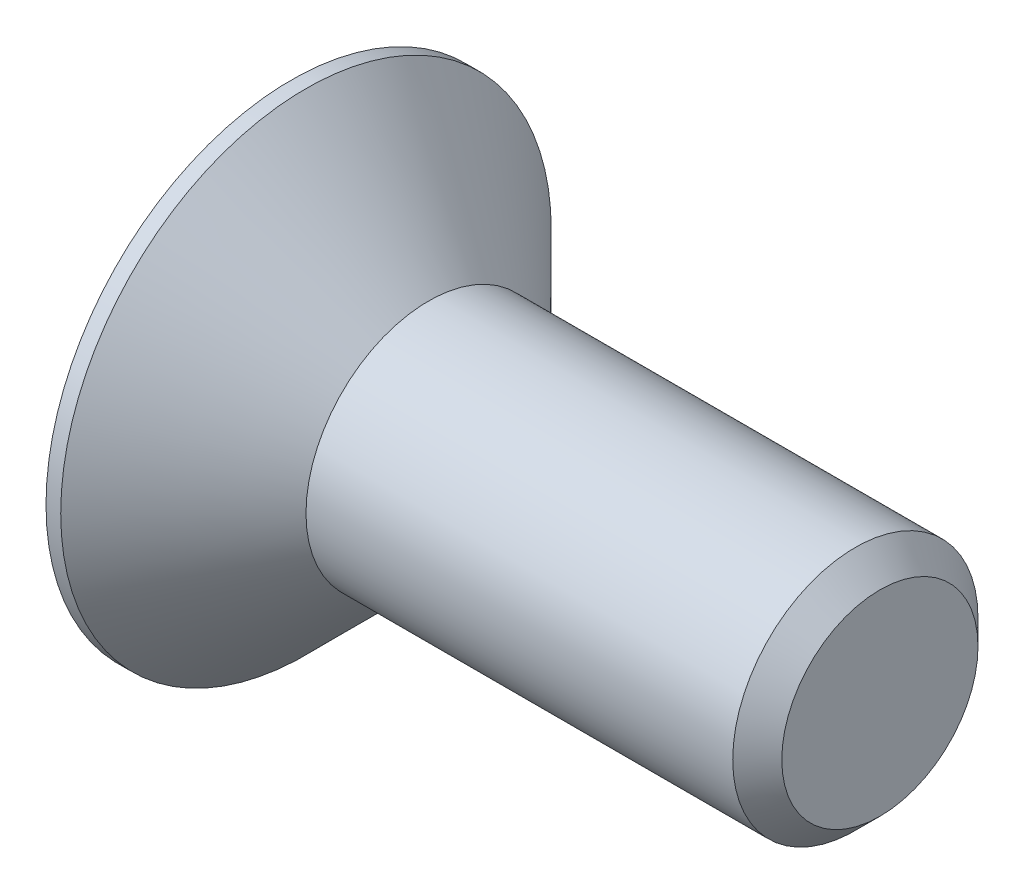
ISO-10303-21;
HEADER;
FILE_DESCRIPTION(('STEP AP214'),'2;1');
FILE_NAME('part.step','',(''),(''),'','','');
FILE_SCHEMA(('AUTOMOTIVE_DESIGN { 1 0 10303 214 1 1 1 1 }'));
ENDSEC;
DATA;
#1=APPLICATION_CONTEXT('core data for automotive mechanical design processes');
#2=APPLICATION_PROTOCOL_DEFINITION('international standard','automotive_design',2000,#1);
#3=PRODUCT_CONTEXT('',#1,'mechanical');
#4=PRODUCT('Part','Part','',(#3));
#5=PRODUCT_RELATED_PRODUCT_CATEGORY('part','',(#4));
#6=PRODUCT_DEFINITION_FORMATION('','',#4);
#7=PRODUCT_DEFINITION_CONTEXT('part definition',#1,'design');
#8=PRODUCT_DEFINITION('design','',#6,#7);
#9=PRODUCT_DEFINITION_SHAPE('','',#8);
#10=(LENGTH_UNIT() NAMED_UNIT(*) SI_UNIT(.MILLI.,.METRE.));
#11=(NAMED_UNIT(*) PLANE_ANGLE_UNIT() SI_UNIT($,.RADIAN.));
#12=(NAMED_UNIT(*) SI_UNIT($,.STERADIAN.) SOLID_ANGLE_UNIT());
#13=UNCERTAINTY_MEASURE_WITH_UNIT(LENGTH_MEASURE(1.E-05),#10,'distance_accuracy_value','');
#14=(GEOMETRIC_REPRESENTATION_CONTEXT(3) GLOBAL_UNCERTAINTY_ASSIGNED_CONTEXT((#13)) GLOBAL_UNIT_ASSIGNED_CONTEXT((#10,
#11,#12)) REPRESENTATION_CONTEXT('',''));
#15=CARTESIAN_POINT('',(0.,0.,0.));
#16=DIRECTION('',(0.,0.,1.));
#17=DIRECTION('',(1.,0.,0.));
#18=AXIS2_PLACEMENT_3D('',#15,#16,#17);
#19=CARTESIAN_POINT('',(0.,0.,0.));
#20=DIRECTION('',(1.,0.,0.));
#21=DIRECTION('',(0.,0.,-1.));
#22=AXIS2_PLACEMENT_3D('',#19,#20,#21);
#23=PLANE('',#22);
#24=DIRECTION('',(0.,0.866025403784439,0.5));
#25=VECTOR('',#24,1.);
#26=CARTESIAN_POINT('',(0.,-0.75,0.433012701892219));
#27=LINE('',#26,#25);
#28=CARTESIAN_POINT('',(0.,-0.75,0.433012701892219));
#29=VERTEX_POINT('',#28);
#30=CARTESIAN_POINT('',(0.,0.,0.866025403784438));
#31=VERTEX_POINT('',#30);
#32=EDGE_CURVE('E131',#29,#31,#27,.T.);
#33=ORIENTED_EDGE('',*,*,#32,.F.);
#34=DIRECTION('',(0.,0.,1.));
#35=VECTOR('',#34,1.);
#36=CARTESIAN_POINT('',(0.,-0.75,-0.43301270189222));
#37=LINE('',#36,#35);
#38=CARTESIAN_POINT('',(0.,-0.75,-0.43301270189222));
#39=VERTEX_POINT('',#38);
#40=EDGE_CURVE('E53',#39,#29,#37,.T.);
#41=ORIENTED_EDGE('',*,*,#40,.F.);
#42=DIRECTION('',(0.,-0.866025403784439,0.5));
#43=VECTOR('',#42,1.);
#44=CARTESIAN_POINT('',(0.,0.,-0.866025403784439));
#45=LINE('',#44,#43);
#46=CARTESIAN_POINT('',(0.,0.,-0.866025403784439));
#47=VERTEX_POINT('',#46);
#48=EDGE_CURVE('E140',#47,#39,#45,.T.);
#49=ORIENTED_EDGE('',*,*,#48,.F.);
#50=DIRECTION('',(0.,-0.866025403784439,-0.5));
#51=VECTOR('',#50,1.);
#52=CARTESIAN_POINT('',(0.,0.75,-0.43301270189222));
#53=LINE('',#52,#51);
#54=CARTESIAN_POINT('',(0.,0.75,-0.43301270189222));
#55=VERTEX_POINT('',#54);
#56=EDGE_CURVE('E138',#55,#47,#53,.T.);
#57=ORIENTED_EDGE('',*,*,#56,.F.);
#58=DIRECTION('',(0.,0.,-1.));
#59=VECTOR('',#58,1.);
#60=CARTESIAN_POINT('',(0.,0.75,0.433012701892219));
#61=LINE('',#60,#59);
#62=CARTESIAN_POINT('',(0.,0.75,0.433012701892219));
#63=VERTEX_POINT('',#62);
#64=EDGE_CURVE('E102',#63,#55,#61,.T.);
#65=ORIENTED_EDGE('',*,*,#64,.F.);
#66=DIRECTION('',(0.,0.866025403784439,-0.5));
#67=VECTOR('',#66,1.);
#68=CARTESIAN_POINT('',(0.,0.,0.866025403784438));
#69=LINE('',#68,#67);
#70=EDGE_CURVE('E134',#31,#63,#69,.T.);
#71=ORIENTED_EDGE('',*,*,#70,.F.);
#72=EDGE_LOOP('',(#33,#41,#49,#57,#65,#71));
#73=FACE_BOUND('',#72,.T.);
#74=CARTESIAN_POINT('',(0.,0.,0.));
#75=DIRECTION('',(-1.,0.,0.));
#76=DIRECTION('',(0.,0.,1.));
#77=AXIS2_PLACEMENT_3D('',#74,#75,#76);
#78=CIRCLE('',#77,2.5);
#79=CARTESIAN_POINT('',(0.,0.,2.5));
#80=VERTEX_POINT('',#79);
#81=EDGE_CURVE('E11',#80,#80,#78,.T.);
#82=ORIENTED_EDGE('',*,*,#81,.T.);
#83=EDGE_LOOP('',(#82));
#84=FACE_BOUND('',#83,.T.);
#85=ADVANCED_FACE('F38',(#73,#84),#23,.F.);
#86=CARTESIAN_POINT('',(-2.28184155946539,0.,0.));
#87=DIRECTION('',(-1.,0.,0.));
#88=DIRECTION('',(0.,0.,1.));
#89=AXIS2_PLACEMENT_3D('',#86,#87,#88);
#90=CYLINDRICAL_SURFACE('',#89,2.5);
#91=ORIENTED_EDGE('',*,*,#81,.F.);
#92=EDGE_LOOP('',(#91));
#93=FACE_BOUND('',#92,.T.);
#94=CARTESIAN_POINT('',(0.15,0.,0.));
#95=DIRECTION('',(-1.,0.,0.));
#96=DIRECTION('',(0.,0.,1.));
#97=AXIS2_PLACEMENT_3D('',#94,#95,#96);
#98=CIRCLE('',#97,2.5);
#99=CARTESIAN_POINT('',(0.15,0.,2.5));
#100=VERTEX_POINT('',#99);
#101=EDGE_CURVE('E46',#100,#100,#98,.T.);
#102=ORIENTED_EDGE('',*,*,#101,.T.);
#103=EDGE_LOOP('',(#102));
#104=FACE_BOUND('',#103,.T.);
#105=ADVANCED_FACE('F164',(#93,#104),#90,.T.);
#106=CARTESIAN_POINT('',(1.4,0.,0.));
#107=DIRECTION('',(-1.,0.,0.));
#108=DIRECTION('',(0.,0.,1.));
#109=AXIS2_PLACEMENT_3D('',#106,#107,#108);
#110=CONICAL_SURFACE('',#109,1.25,0.78539816339745);
#111=ORIENTED_EDGE('',*,*,#101,.F.);
#112=EDGE_LOOP('',(#111));
#113=FACE_BOUND('',#112,.T.);
#114=CARTESIAN_POINT('',(1.4,0.,0.));
#115=DIRECTION('',(-1.,0.,0.));
#116=DIRECTION('',(0.,0.,1.));
#117=AXIS2_PLACEMENT_3D('',#114,#115,#116);
#118=CIRCLE('',#117,1.25);
#119=CARTESIAN_POINT('',(1.4,0.,1.25));
#120=VERTEX_POINT('',#119);
#121=EDGE_CURVE('E157',#120,#120,#118,.T.);
#122=ORIENTED_EDGE('',*,*,#121,.T.);
#123=EDGE_LOOP('',(#122));
#124=FACE_BOUND('',#123,.T.);
#125=ADVANCED_FACE('F166',(#113,#124),#110,.T.);
#126=CARTESIAN_POINT('',(-2.28184155946539,0.,0.));
#127=DIRECTION('',(-1.,0.,0.));
#128=DIRECTION('',(0.,0.,1.));
#129=AXIS2_PLACEMENT_3D('',#126,#127,#128);
#130=CYLINDRICAL_SURFACE('',#129,1.25);
#131=ORIENTED_EDGE('',*,*,#121,.F.);
#132=EDGE_LOOP('',(#131));
#133=FACE_BOUND('',#132,.T.);
#134=CARTESIAN_POINT('',(5.75,0.,0.));
#135=DIRECTION('',(-1.,0.,0.));
#136=DIRECTION('',(0.,0.,1.));
#137=AXIS2_PLACEMENT_3D('',#134,#135,#136);
#138=CIRCLE('',#137,1.25);
#139=CARTESIAN_POINT('',(5.75,0.,1.25));
#140=VERTEX_POINT('',#139);
#141=EDGE_CURVE('E153',#140,#140,#138,.T.);
#142=ORIENTED_EDGE('',*,*,#141,.T.);
#143=EDGE_LOOP('',(#142));
#144=FACE_BOUND('',#143,.T.);
#145=ADVANCED_FACE('F169',(#133,#144),#130,.T.);
#146=CARTESIAN_POINT('',(6.,0.,0.));
#147=DIRECTION('',(-1.,0.,0.));
#148=DIRECTION('',(0.,0.,1.));
#149=AXIS2_PLACEMENT_3D('',#146,#147,#148);
#150=CONICAL_SURFACE('',#149,1.,0.785398163397448);
#151=ORIENTED_EDGE('',*,*,#141,.F.);
#152=EDGE_LOOP('',(#151));
#153=FACE_BOUND('',#152,.T.);
#154=CARTESIAN_POINT('',(6.,0.,0.));
#155=DIRECTION('',(-1.,0.,0.));
#156=DIRECTION('',(0.,0.,1.));
#157=AXIS2_PLACEMENT_3D('',#154,#155,#156);
#158=CIRCLE('',#157,1.);
#159=CARTESIAN_POINT('',(6.,0.,1.));
#160=VERTEX_POINT('',#159);
#161=EDGE_CURVE('E144',#160,#160,#158,.T.);
#162=ORIENTED_EDGE('',*,*,#161,.T.);
#163=EDGE_LOOP('',(#162));
#164=FACE_BOUND('',#163,.T.);
#165=ADVANCED_FACE('F175',(#153,#164),#150,.T.);
#166=CARTESIAN_POINT('',(6.,1.,0.));
#167=DIRECTION('',(-1.,0.,0.));
#168=DIRECTION('',(0.,0.,1.));
#169=AXIS2_PLACEMENT_3D('',#166,#167,#168);
#170=PLANE('',#169);
#171=ORIENTED_EDGE('',*,*,#161,.F.);
#172=EDGE_LOOP('',(#171));
#173=FACE_BOUND('',#172,.T.);
#174=ADVANCED_FACE('F181',(#173),#170,.F.);
#175=CARTESIAN_POINT('',(0.8,-0.75,-0.43301270189222));
#176=DIRECTION('',(0.,-1.,0.));
#177=DIRECTION('',(0.,0.,-1.));
#178=AXIS2_PLACEMENT_3D('',#175,#176,#177);
#179=PLANE('',#178);
#180=ORIENTED_EDGE('',*,*,#40,.T.);
#181=DIRECTION('',(-1.,0.,0.));
#182=VECTOR('',#181,1.);
#183=CARTESIAN_POINT('',(0.8,-0.75,0.433012701892219));
#184=LINE('',#183,#182);
#185=CARTESIAN_POINT('',(0.8,-0.75,0.433012701892219));
#186=VERTEX_POINT('',#185);
#187=EDGE_CURVE('E83',#186,#29,#184,.T.);
#188=ORIENTED_EDGE('',*,*,#187,.F.);
#189=DIRECTION('',(0.,0.,1.));
#190=VECTOR('',#189,1.);
#191=CARTESIAN_POINT('',(0.8,-0.75,-0.43301270189222));
#192=LINE('',#191,#190);
#193=CARTESIAN_POINT('',(0.8,-0.75,-0.43301270189222));
#194=VERTEX_POINT('',#193);
#195=EDGE_CURVE('E142',#194,#186,#192,.T.);
#196=ORIENTED_EDGE('',*,*,#195,.F.);
#197=DIRECTION('',(-1.,0.,0.));
#198=VECTOR('',#197,1.);
#199=CARTESIAN_POINT('',(0.8,-0.75,-0.43301270189222));
#200=LINE('',#199,#198);
#201=EDGE_CURVE('E61',#194,#39,#200,.T.);
#202=ORIENTED_EDGE('',*,*,#201,.T.);
#203=EDGE_LOOP('',(#180,#188,#196,#202));
#204=FACE_BOUND('',#203,.T.);
#205=ADVANCED_FACE('F186',(#204),#179,.F.);
#206=CARTESIAN_POINT('',(0.8,0.,-0.866025403784439));
#207=DIRECTION('',(0.,-0.5,-0.866025403784439));
#208=DIRECTION('',(0.,0.866025403784439,-0.5));
#209=AXIS2_PLACEMENT_3D('',#206,#207,#208);
#210=PLANE('',#209);
#211=ORIENTED_EDGE('',*,*,#48,.T.);
#212=ORIENTED_EDGE('',*,*,#201,.F.);
#213=DIRECTION('',(0.,-0.866025403784439,0.5));
#214=VECTOR('',#213,1.);
#215=CARTESIAN_POINT('',(0.8,0.,-0.866025403784439));
#216=LINE('',#215,#214);
#217=CARTESIAN_POINT('',(0.8,0.,-0.866025403784439));
#218=VERTEX_POINT('',#217);
#219=EDGE_CURVE('E114',#218,#194,#216,.T.);
#220=ORIENTED_EDGE('',*,*,#219,.F.);
#221=DIRECTION('',(-1.,0.,0.));
#222=VECTOR('',#221,1.);
#223=CARTESIAN_POINT('',(0.8,0.,-0.866025403784439));
#224=LINE('',#223,#222);
#225=EDGE_CURVE('E106',#218,#47,#224,.T.);
#226=ORIENTED_EDGE('',*,*,#225,.T.);
#227=EDGE_LOOP('',(#211,#212,#220,#226));
#228=FACE_BOUND('',#227,.T.);
#229=ADVANCED_FACE('F191',(#228),#210,.F.);
#230=CARTESIAN_POINT('',(0.8,0.75,-0.43301270189222));
#231=DIRECTION('',(0.,0.5,-0.866025403784439));
#232=DIRECTION('',(0.,0.866025403784439,0.5));
#233=AXIS2_PLACEMENT_3D('',#230,#231,#232);
#234=PLANE('',#233);
#235=ORIENTED_EDGE('',*,*,#56,.T.);
#236=ORIENTED_EDGE('',*,*,#225,.F.);
#237=DIRECTION('',(0.,-0.866025403784439,-0.5));
#238=VECTOR('',#237,1.);
#239=CARTESIAN_POINT('',(0.8,0.75,-0.43301270189222));
#240=LINE('',#239,#238);
#241=CARTESIAN_POINT('',(0.8,0.75,-0.43301270189222));
#242=VERTEX_POINT('',#241);
#243=EDGE_CURVE('E110',#242,#218,#240,.T.);
#244=ORIENTED_EDGE('',*,*,#243,.F.);
#245=DIRECTION('',(-1.,0.,0.));
#246=VECTOR('',#245,1.);
#247=CARTESIAN_POINT('',(0.8,0.75,-0.43301270189222));
#248=LINE('',#247,#246);
#249=EDGE_CURVE('E95',#242,#55,#248,.T.);
#250=ORIENTED_EDGE('',*,*,#249,.T.);
#251=EDGE_LOOP('',(#235,#236,#244,#250));
#252=FACE_BOUND('',#251,.T.);
#253=ADVANCED_FACE('F111',(#252),#234,.F.);
#254=CARTESIAN_POINT('',(0.8,0.75,0.433012701892219));
#255=DIRECTION('',(0.,1.,0.));
#256=DIRECTION('',(0.,0.,1.));
#257=AXIS2_PLACEMENT_3D('',#254,#255,#256);
#258=PLANE('',#257);
#259=ORIENTED_EDGE('',*,*,#64,.T.);
#260=ORIENTED_EDGE('',*,*,#249,.F.);
#261=DIRECTION('',(0.,0.,-1.));
#262=VECTOR('',#261,1.);
#263=CARTESIAN_POINT('',(0.8,0.75,0.433012701892219));
#264=LINE('',#263,#262);
#265=CARTESIAN_POINT('',(0.8,0.75,0.433012701892219));
#266=VERTEX_POINT('',#265);
#267=EDGE_CURVE('E99',#266,#242,#264,.T.);
#268=ORIENTED_EDGE('',*,*,#267,.F.);
#269=DIRECTION('',(-1.,0.,0.));
#270=VECTOR('',#269,1.);
#271=CARTESIAN_POINT('',(0.8,0.75,0.433012701892219));
#272=LINE('',#271,#270);
#273=EDGE_CURVE('E107',#266,#63,#272,.T.);
#274=ORIENTED_EDGE('',*,*,#273,.T.);
#275=EDGE_LOOP('',(#259,#260,#268,#274));
#276=FACE_BOUND('',#275,.T.);
#277=ADVANCED_FACE('F97',(#276),#258,.F.);
#278=CARTESIAN_POINT('',(0.8,0.,0.866025403784438));
#279=DIRECTION('',(0.,0.5,0.866025403784439));
#280=DIRECTION('',(0.,-0.866025403784439,0.5));
#281=AXIS2_PLACEMENT_3D('',#278,#279,#280);
#282=PLANE('',#281);
#283=ORIENTED_EDGE('',*,*,#70,.T.);
#284=ORIENTED_EDGE('',*,*,#273,.F.);
#285=DIRECTION('',(0.,0.866025403784439,-0.5));
#286=VECTOR('',#285,1.);
#287=CARTESIAN_POINT('',(0.8,0.,0.866025403784438));
#288=LINE('',#287,#286);
#289=CARTESIAN_POINT('',(0.8,0.,0.866025403784438));
#290=VERTEX_POINT('',#289);
#291=EDGE_CURVE('E120',#290,#266,#288,.T.);
#292=ORIENTED_EDGE('',*,*,#291,.F.);
#293=DIRECTION('',(-1.,0.,0.));
#294=VECTOR('',#293,1.);
#295=CARTESIAN_POINT('',(0.8,0.,0.866025403784438));
#296=LINE('',#295,#294);
#297=EDGE_CURVE('E147',#290,#31,#296,.T.);
#298=ORIENTED_EDGE('',*,*,#297,.T.);
#299=EDGE_LOOP('',(#283,#284,#292,#298));
#300=FACE_BOUND('',#299,.T.);
#301=ADVANCED_FACE('F217',(#300),#282,.F.);
#302=CARTESIAN_POINT('',(0.8,-0.75,0.433012701892219));
#303=DIRECTION('',(0.,-0.5,0.866025403784439));
#304=DIRECTION('',(0.,-0.866025403784439,-0.5));
#305=AXIS2_PLACEMENT_3D('',#302,#303,#304);
#306=PLANE('',#305);
#307=ORIENTED_EDGE('',*,*,#32,.T.);
#308=ORIENTED_EDGE('',*,*,#297,.F.);
#309=DIRECTION('',(0.,0.866025403784439,0.5));
#310=VECTOR('',#309,1.);
#311=CARTESIAN_POINT('',(0.8,-0.75,0.433012701892219));
#312=LINE('',#311,#310);
#313=EDGE_CURVE('E125',#186,#290,#312,.T.);
#314=ORIENTED_EDGE('',*,*,#313,.F.);
#315=ORIENTED_EDGE('',*,*,#187,.T.);
#316=EDGE_LOOP('',(#307,#308,#314,#315));
#317=FACE_BOUND('',#316,.T.);
#318=ADVANCED_FACE('F205',(#317),#306,.F.);
#319=CARTESIAN_POINT('',(0.8,0.,0.));
#320=DIRECTION('',(-1.,0.,0.));
#321=DIRECTION('',(0.,0.,1.));
#322=AXIS2_PLACEMENT_3D('',#319,#320,#321);
#323=PLANE('',#322);
#324=ORIENTED_EDGE('',*,*,#195,.T.);
#325=ORIENTED_EDGE('',*,*,#313,.T.);
#326=ORIENTED_EDGE('',*,*,#291,.T.);
#327=ORIENTED_EDGE('',*,*,#267,.T.);
#328=ORIENTED_EDGE('',*,*,#243,.T.);
#329=ORIENTED_EDGE('',*,*,#219,.T.);
#330=EDGE_LOOP('',(#324,#325,#326,#327,#328,#329));
#331=FACE_BOUND('',#330,.T.);
#332=ADVANCED_FACE('F117',(#331),#323,.T.);
#333=CLOSED_SHELL('',(#85,#105,#125,#145,#165,#174,#205,#229,#253,#277,#301,#318,#332));
#334=MANIFOLD_SOLID_BREP('B2',#333);
#335=ADVANCED_BREP_SHAPE_REPRESENTATION('',(#18,#334),#14);
#336=SHAPE_DEFINITION_REPRESENTATION(#9,#335);
ENDSEC;
END-ISO-10303-21;
